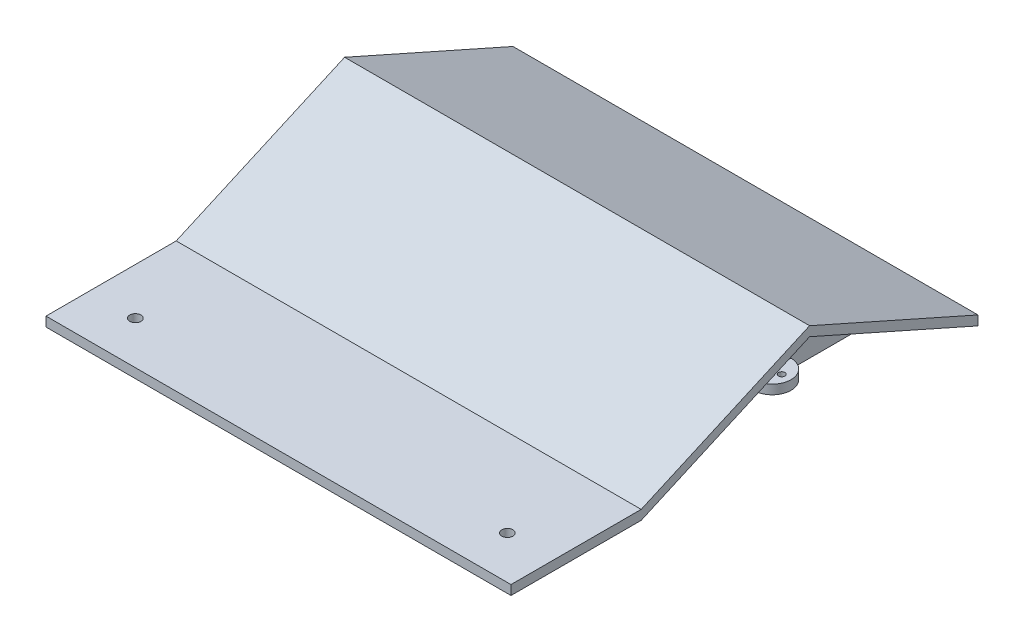
ISO-10303-21;
HEADER;
FILE_DESCRIPTION(('STEP AP214'),'2;1');
FILE_NAME('part.step','',(''),(''),'','','');
FILE_SCHEMA(('AUTOMOTIVE_DESIGN { 1 0 10303 214 1 1 1 1 }'));
ENDSEC;
DATA;
#1=APPLICATION_CONTEXT('core data for automotive mechanical design processes');
#2=APPLICATION_PROTOCOL_DEFINITION('international standard','automotive_design',2000,#1);
#3=PRODUCT_CONTEXT('',#1,'mechanical');
#4=PRODUCT('Part','Part','',(#3));
#5=PRODUCT_RELATED_PRODUCT_CATEGORY('part','',(#4));
#6=PRODUCT_DEFINITION_FORMATION('','',#4);
#7=PRODUCT_DEFINITION_CONTEXT('part definition',#1,'design');
#8=PRODUCT_DEFINITION('design','',#6,#7);
#9=PRODUCT_DEFINITION_SHAPE('','',#8);
#10=(LENGTH_UNIT() NAMED_UNIT(*) SI_UNIT(.MILLI.,.METRE.));
#11=(NAMED_UNIT(*) PLANE_ANGLE_UNIT() SI_UNIT($,.RADIAN.));
#12=(NAMED_UNIT(*) SI_UNIT($,.STERADIAN.) SOLID_ANGLE_UNIT());
#13=UNCERTAINTY_MEASURE_WITH_UNIT(LENGTH_MEASURE(1.E-05),#10,'distance_accuracy_value','');
#14=(GEOMETRIC_REPRESENTATION_CONTEXT(3) GLOBAL_UNCERTAINTY_ASSIGNED_CONTEXT((#13)) GLOBAL_UNIT_ASSIGNED_CONTEXT((#10,
#11,#12)) REPRESENTATION_CONTEXT('',''));
#15=CARTESIAN_POINT('',(0.,0.,0.));
#16=DIRECTION('',(0.,0.,1.));
#17=DIRECTION('',(1.,0.,0.));
#18=AXIS2_PLACEMENT_3D('',#15,#16,#17);
#19=CARTESIAN_POINT('',(-250.,4.27585831422593,1.9003814729893));
#20=DIRECTION('',(0.,-0.913811548620257,-0.406138466053448));
#21=DIRECTION('',(0.,0.406138466053448,-0.913811548620257));
#22=AXIS2_PLACEMENT_3D('',#19,#20,#21);
#23=PLANE('',#22);
#24=DIRECTION('',(0.,0.406138466053448,-0.913811548620257));
#25=VECTOR('',#24,1.);
#26=CARTESIAN_POINT('',(0.,4.27585831422593,1.9003814729893));
#27=LINE('',#26,#25);
#28=CARTESIAN_POINT('',(0.,-5.12047230222117,23.0421253599953));
#29=VERTEX_POINT('',#28);
#30=CARTESIAN_POINT('',(0.,35.1204723022212,-67.5));
#31=VERTEX_POINT('',#30);
#32=EDGE_CURVE('E210',#29,#31,#27,.T.);
#33=ORIENTED_EDGE('',*,*,#32,.T.);
#34=DIRECTION('',(1.,0.,0.));
#35=VECTOR('',#34,1.);
#36=CARTESIAN_POINT('',(-250.,35.1204723022212,-67.5));
#37=LINE('',#36,#35);
#38=CARTESIAN_POINT('',(-250.,35.1204723022212,-67.5));
#39=VERTEX_POINT('',#38);
#40=EDGE_CURVE('E431',#39,#31,#37,.T.);
#41=ORIENTED_EDGE('',*,*,#40,.F.);
#42=DIRECTION('',(0.,0.406138466053448,-0.913811548620257));
#43=VECTOR('',#42,1.);
#44=CARTESIAN_POINT('',(-250.,4.27585831422593,1.9003814729893));
#45=LINE('',#44,#43);
#46=CARTESIAN_POINT('',(-250.,-5.12047230222117,23.0421253599953));
#47=VERTEX_POINT('',#46);
#48=EDGE_CURVE('E401',#47,#39,#45,.T.);
#49=ORIENTED_EDGE('',*,*,#48,.F.);
#50=DIRECTION('',(1.,0.,0.));
#51=VECTOR('',#50,1.);
#52=CARTESIAN_POINT('',(-250.,-5.12047230222117,23.0421253599953));
#53=LINE('',#52,#51);
#54=EDGE_CURVE('E220',#47,#29,#53,.T.);
#55=ORIENTED_EDGE('',*,*,#54,.T.);
#56=EDGE_LOOP('',(#33,#41,#49,#55));
#57=FACE_BOUND('',#56,.T.);
#58=ADVANCED_FACE('F41',(#57),#23,.F.);
#59=CARTESIAN_POINT('',(-250.,54.3789510977311,-24.1684227101027));
#60=DIRECTION('',(0.,0.913811548620257,-0.406138466053448));
#61=DIRECTION('',(0.,0.406138466053448,0.913811548620257));
#62=AXIS2_PLACEMENT_3D('',#59,#60,#61);
#63=PLANE('',#62);
#64=DIRECTION('',(0.,0.406138466053448,0.913811548620257));
#65=VECTOR('',#64,1.);
#66=CARTESIAN_POINT('',(0.,54.3789510977311,-24.1684227101027));
#67=LINE('',#66,#65);
#68=CARTESIAN_POINT('',(0.,-5.12047230222117,-158.042125359995));
#69=VERTEX_POINT('',#68);
#70=EDGE_CURVE('E405',#69,#31,#67,.T.);
#71=ORIENTED_EDGE('',*,*,#70,.F.);
#72=DIRECTION('',(1.,0.,0.));
#73=VECTOR('',#72,1.);
#74=CARTESIAN_POINT('',(-250.,-5.12047230222117,-158.042125359995));
#75=LINE('',#74,#73);
#76=CARTESIAN_POINT('',(-250.,-5.12047230222117,-158.042125359995));
#77=VERTEX_POINT('',#76);
#78=EDGE_CURVE('E435',#77,#69,#75,.T.);
#79=ORIENTED_EDGE('',*,*,#78,.F.);
#80=DIRECTION('',(0.,0.406138466053448,0.913811548620257));
#81=VECTOR('',#80,1.);
#82=CARTESIAN_POINT('',(-250.,54.3789510977311,-24.1684227101027));
#83=LINE('',#82,#81);
#84=EDGE_CURVE('E415',#77,#39,#83,.T.);
#85=ORIENTED_EDGE('',*,*,#84,.T.);
#86=ORIENTED_EDGE('',*,*,#40,.T.);
#87=EDGE_LOOP('',(#71,#79,#85,#86));
#88=FACE_BOUND('',#87,.T.);
#89=ADVANCED_FACE('F498',(#88),#63,.T.);
#90=CARTESIAN_POINT('',(-250.,0.,-158.042125359995));
#91=DIRECTION('',(0.,0.,-1.));
#92=DIRECTION('',(-1.,0.,0.));
#93=AXIS2_PLACEMENT_3D('',#90,#91,#92);
#94=PLANE('',#93);
#95=DIRECTION('',(0.,1.,0.));
#96=VECTOR('',#95,1.);
#97=CARTESIAN_POINT('',(0.,0.,-158.042125359995));
#98=LINE('',#97,#96);
#99=CARTESIAN_POINT('',(0.,-10.2409446044423,-158.042125359995));
#100=VERTEX_POINT('',#99);
#101=EDGE_CURVE('E424',#100,#69,#98,.T.);
#102=ORIENTED_EDGE('',*,*,#101,.F.);
#103=DIRECTION('',(1.,0.,0.));
#104=VECTOR('',#103,1.);
#105=CARTESIAN_POINT('',(-250.,-10.2409446044423,-158.042125359995));
#106=LINE('',#105,#104);
#107=CARTESIAN_POINT('',(-250.,-10.2409446044423,-158.042125359995));
#108=VERTEX_POINT('',#107);
#109=EDGE_CURVE('E438',#108,#100,#106,.T.);
#110=ORIENTED_EDGE('',*,*,#109,.F.);
#111=DIRECTION('',(0.,1.,0.));
#112=VECTOR('',#111,1.);
#113=CARTESIAN_POINT('',(-250.,0.,-158.042125359995));
#114=LINE('',#113,#112);
#115=EDGE_CURVE('E411',#108,#77,#114,.T.);
#116=ORIENTED_EDGE('',*,*,#115,.T.);
#117=ORIENTED_EDGE('',*,*,#78,.T.);
#118=EDGE_LOOP('',(#102,#110,#116,#117));
#119=FACE_BOUND('',#118,.T.);
#120=ADVANCED_FACE('F504',(#119),#94,.T.);
#121=CARTESIAN_POINT('',(-250.,50.1030927835052,-22.2680412371134));
#122=DIRECTION('',(0.,-0.913811548620257,0.406138466053448));
#123=DIRECTION('',(0.,-0.406138466053448,-0.913811548620257));
#124=AXIS2_PLACEMENT_3D('',#121,#122,#123);
#125=PLANE('',#124);
#126=DIRECTION('',(-1.,0.,0.));
#127=VECTOR('',#126,1.);
#128=CARTESIAN_POINT('',(-225.,0.,-135.));
#129=LINE('',#128,#127);
#130=CARTESIAN_POINT('',(-225.,0.,-135.));
#131=VERTEX_POINT('',#130);
#132=CARTESIAN_POINT('',(-230.,0.,-135.));
#133=VERTEX_POINT('',#132);
#134=EDGE_CURVE('E360',#131,#133,#129,.T.);
#135=ORIENTED_EDGE('',*,*,#134,.T.);
#136=DIRECTION('',(-1.,0.,0.));
#137=VECTOR('',#136,1.);
#138=CARTESIAN_POINT('',(-230.,0.,-135.));
#139=LINE('',#138,#137);
#140=CARTESIAN_POINT('',(-250.,0.,-135.));
#141=VERTEX_POINT('',#140);
#142=EDGE_CURVE('E332',#133,#141,#139,.T.);
#143=ORIENTED_EDGE('',*,*,#142,.T.);
#144=DIRECTION('',(0.,-0.406138466053448,-0.913811548620257));
#145=VECTOR('',#144,1.);
#146=CARTESIAN_POINT('',(-250.,50.1030927835052,-22.2680412371134));
#147=LINE('',#146,#145);
#148=EDGE_CURVE('E408',#141,#108,#147,.T.);
#149=ORIENTED_EDGE('',*,*,#148,.T.);
#150=ORIENTED_EDGE('',*,*,#109,.T.);
#151=DIRECTION('',(0.,-0.406138466053448,-0.913811548620257));
#152=VECTOR('',#151,1.);
#153=CARTESIAN_POINT('',(0.,50.1030927835052,-22.2680412371134));
#154=LINE('',#153,#152);
#155=CARTESIAN_POINT('',(0.,29.9999999999999,-67.5));
#156=VERTEX_POINT('',#155);
#157=EDGE_CURVE('E209',#156,#100,#154,.T.);
#158=ORIENTED_EDGE('',*,*,#157,.F.);
#159=DIRECTION('',(1.,0.,0.));
#160=VECTOR('',#159,1.);
#161=CARTESIAN_POINT('',(-20.,29.9999999999999,-67.5));
#162=LINE('',#161,#160);
#163=CARTESIAN_POINT('',(-20.,29.9999999999999,-67.5));
#164=VERTEX_POINT('',#163);
#165=EDGE_CURVE('E204',#164,#156,#162,.T.);
#166=ORIENTED_EDGE('',*,*,#165,.F.);
#167=DIRECTION('',(0.,0.406138466053447,0.913811548620257));
#168=VECTOR('',#167,1.);
#169=CARTESIAN_POINT('',(-20.,0.,-135.));
#170=LINE('',#169,#168);
#171=CARTESIAN_POINT('',(-20.,0.,-135.));
#172=VERTEX_POINT('',#171);
#173=EDGE_CURVE('E375',#172,#164,#170,.T.);
#174=ORIENTED_EDGE('',*,*,#173,.F.);
#175=DIRECTION('',(1.,0.,0.));
#176=VECTOR('',#175,1.);
#177=CARTESIAN_POINT('',(-25.,0.,-135.));
#178=LINE('',#177,#176);
#179=CARTESIAN_POINT('',(-25.,0.,-135.));
#180=VERTEX_POINT('',#179);
#181=EDGE_CURVE('E394',#180,#172,#178,.T.);
#182=ORIENTED_EDGE('',*,*,#181,.F.);
#183=DIRECTION('',(0.,0.406138466053448,0.913811548620257));
#184=VECTOR('',#183,1.);
#185=CARTESIAN_POINT('',(-25.,0.,-135.));
#186=LINE('',#185,#184);
#187=CARTESIAN_POINT('',(-25.,30.,-67.5));
#188=VERTEX_POINT('',#187);
#189=EDGE_CURVE('E389',#180,#188,#186,.T.);
#190=ORIENTED_EDGE('',*,*,#189,.T.);
#191=DIRECTION('',(1.,0.,0.));
#192=VECTOR('',#191,1.);
#193=CARTESIAN_POINT('',(-250.,30.,-67.5));
#194=LINE('',#193,#192);
#195=CARTESIAN_POINT('',(-225.,30.,-67.5));
#196=VERTEX_POINT('',#195);
#197=EDGE_CURVE('E219',#196,#188,#194,.T.);
#198=ORIENTED_EDGE('',*,*,#197,.F.);
#199=DIRECTION('',(0.,-0.406138466053448,-0.913811548620257));
#200=VECTOR('',#199,1.);
#201=CARTESIAN_POINT('',(-225.,30.,-67.5));
#202=LINE('',#201,#200);
#203=EDGE_CURVE('E341',#196,#131,#202,.T.);
#204=ORIENTED_EDGE('',*,*,#203,.T.);
#205=EDGE_LOOP('',(#135,#143,#149,#150,#158,#166,#174,#182,#190,#198,#204));
#206=FACE_BOUND('',#205,.T.);
#207=ADVANCED_FACE('F506',(#206),#125,.T.);
#208=CARTESIAN_POINT('',(-250.,0.,0.));
#209=DIRECTION('',(0.,0.913811548620257,0.406138466053448));
#210=DIRECTION('',(0.,-0.406138466053448,0.913811548620257));
#211=AXIS2_PLACEMENT_3D('',#208,#209,#210);
#212=PLANE('',#211);
#213=DIRECTION('',(0.,-0.406138466053448,0.913811548620257));
#214=VECTOR('',#213,1.);
#215=CARTESIAN_POINT('',(-250.,0.,0.));
#216=LINE('',#215,#214);
#217=CARTESIAN_POINT('',(-250.,0.,0.));
#218=VERTEX_POINT('',#217);
#219=CARTESIAN_POINT('',(-250.,-10.2409446044423,23.0421253599953));
#220=VERTEX_POINT('',#219);
#221=EDGE_CURVE('E404',#218,#220,#216,.T.);
#222=ORIENTED_EDGE('',*,*,#221,.F.);
#223=DIRECTION('',(-1.,0.,0.));
#224=VECTOR('',#223,1.);
#225=CARTESIAN_POINT('',(-230.,0.,0.));
#226=LINE('',#225,#224);
#227=CARTESIAN_POINT('',(-230.,0.,0.));
#228=VERTEX_POINT('',#227);
#229=EDGE_CURVE('E342',#228,#218,#226,.T.);
#230=ORIENTED_EDGE('',*,*,#229,.F.);
#231=DIRECTION('',(-1.,0.,0.));
#232=VECTOR('',#231,1.);
#233=CARTESIAN_POINT('',(-225.,0.,0.));
#234=LINE('',#233,#232);
#235=CARTESIAN_POINT('',(-225.,0.,0.));
#236=VERTEX_POINT('',#235);
#237=EDGE_CURVE('E361',#236,#228,#234,.T.);
#238=ORIENTED_EDGE('',*,*,#237,.F.);
#239=DIRECTION('',(0.,0.406138466053448,-0.913811548620257));
#240=VECTOR('',#239,1.);
#241=CARTESIAN_POINT('',(-225.,0.,0.));
#242=LINE('',#241,#240);
#243=EDGE_CURVE('E356',#236,#196,#242,.T.);
#244=ORIENTED_EDGE('',*,*,#243,.T.);
#245=ORIENTED_EDGE('',*,*,#197,.T.);
#246=DIRECTION('',(0.,-0.406138466053448,0.913811548620257));
#247=VECTOR('',#246,1.);
#248=CARTESIAN_POINT('',(-25.,30.,-67.5));
#249=LINE('',#248,#247);
#250=CARTESIAN_POINT('',(-25.,0.,0.));
#251=VERTEX_POINT('',#250);
#252=EDGE_CURVE('E381',#188,#251,#249,.T.);
#253=ORIENTED_EDGE('',*,*,#252,.T.);
#254=DIRECTION('',(1.,0.,0.));
#255=VECTOR('',#254,1.);
#256=CARTESIAN_POINT('',(-25.,0.,0.));
#257=LINE('',#256,#255);
#258=CARTESIAN_POINT('',(-20.,0.,0.));
#259=VERTEX_POINT('',#258);
#260=EDGE_CURVE('E393',#251,#259,#257,.T.);
#261=ORIENTED_EDGE('',*,*,#260,.T.);
#262=DIRECTION('',(0.,-0.406138466053447,0.913811548620257));
#263=VECTOR('',#262,1.);
#264=CARTESIAN_POINT('',(-20.,29.9999999999999,-67.5));
#265=LINE('',#264,#263);
#266=EDGE_CURVE('E365',#164,#259,#265,.T.);
#267=ORIENTED_EDGE('',*,*,#266,.F.);
#268=ORIENTED_EDGE('',*,*,#165,.T.);
#269=DIRECTION('',(0.,-0.406138466053448,0.913811548620257));
#270=VECTOR('',#269,1.);
#271=CARTESIAN_POINT('',(0.,0.,0.));
#272=LINE('',#271,#270);
#273=CARTESIAN_POINT('',(0.,-10.2409446044423,23.0421253599953));
#274=VERTEX_POINT('',#273);
#275=EDGE_CURVE('E197',#156,#274,#272,.T.);
#276=ORIENTED_EDGE('',*,*,#275,.T.);
#277=DIRECTION('',(1.,0.,0.));
#278=VECTOR('',#277,1.);
#279=CARTESIAN_POINT('',(-250.,-10.2409446044423,23.0421253599953));
#280=LINE('',#279,#278);
#281=EDGE_CURVE('E201',#220,#274,#280,.T.);
#282=ORIENTED_EDGE('',*,*,#281,.F.);
#283=EDGE_LOOP('',(#222,#230,#238,#244,#245,#253,#261,#267,#268,#276,#282));
#284=FACE_BOUND('',#283,.T.);
#285=ADVANCED_FACE('F200',(#284),#212,.F.);
#286=CARTESIAN_POINT('',(-250.,0.,0.));
#287=DIRECTION('',(1.,0.,0.));
#288=DIRECTION('',(0.,0.,-1.));
#289=AXIS2_PLACEMENT_3D('',#286,#287,#288);
#290=PLANE('',#289);
#291=ORIENTED_EDGE('',*,*,#148,.F.);
#292=DIRECTION('',(0.,-0.401404468732289,-0.915900896648622));
#293=VECTOR('',#292,1.);
#294=CARTESIAN_POINT('',(-250.,29.5826783646268,-67.5));
#295=LINE('',#294,#293);
#296=CARTESIAN_POINT('',(-250.,29.5826783646268,-67.5));
#297=VERTEX_POINT('',#296);
#298=EDGE_CURVE('E319',#297,#141,#295,.T.);
#299=ORIENTED_EDGE('',*,*,#298,.F.);
#300=DIRECTION('',(0.,0.401404468732289,-0.915900896648622));
#301=VECTOR('',#300,1.);
#302=CARTESIAN_POINT('',(-250.,0.,0.));
#303=LINE('',#302,#301);
#304=EDGE_CURVE('E324',#218,#297,#303,.T.);
#305=ORIENTED_EDGE('',*,*,#304,.F.);
#306=ORIENTED_EDGE('',*,*,#221,.T.);
#307=DIRECTION('',(0.,0.,1.));
#308=VECTOR('',#307,1.);
#309=CARTESIAN_POINT('',(-250.,-10.2409446044423,93.0421253599953));
#310=LINE('',#309,#308);
#311=CARTESIAN_POINT('',(-250.,-10.2409446044423,93.0421253599953));
#312=VERTEX_POINT('',#311);
#313=EDGE_CURVE('E217',#220,#312,#310,.T.);
#314=ORIENTED_EDGE('',*,*,#313,.T.);
#315=DIRECTION('',(0.,1.,0.));
#316=VECTOR('',#315,1.);
#317=CARTESIAN_POINT('',(-250.,-5.12047230222117,93.0421253599953));
#318=LINE('',#317,#316);
#319=CARTESIAN_POINT('',(-250.,-5.12047230222117,93.0421253599953));
#320=VERTEX_POINT('',#319);
#321=EDGE_CURVE('E235',#312,#320,#318,.T.);
#322=ORIENTED_EDGE('',*,*,#321,.T.);
#323=DIRECTION('',(0.,0.,-1.));
#324=VECTOR('',#323,1.);
#325=CARTESIAN_POINT('',(-250.,-5.12047230222117,23.0421253599953));
#326=LINE('',#325,#324);
#327=EDGE_CURVE('E228',#320,#47,#326,.T.);
#328=ORIENTED_EDGE('',*,*,#327,.T.);
#329=ORIENTED_EDGE('',*,*,#48,.T.);
#330=ORIENTED_EDGE('',*,*,#84,.F.);
#331=ORIENTED_EDGE('',*,*,#115,.F.);
#332=EDGE_LOOP('',(#291,#299,#305,#306,#314,#322,#328,#329,#330,#331));
#333=FACE_BOUND('',#332,.T.);
#334=ADVANCED_FACE('F489',(#333),#290,.F.);
#335=CARTESIAN_POINT('',(0.,0.,0.));
#336=DIRECTION('',(1.,0.,0.));
#337=DIRECTION('',(0.,0.,-1.));
#338=AXIS2_PLACEMENT_3D('',#335,#336,#337);
#339=PLANE('',#338);
#340=ORIENTED_EDGE('',*,*,#275,.F.);
#341=ORIENTED_EDGE('',*,*,#157,.T.);
#342=ORIENTED_EDGE('',*,*,#101,.T.);
#343=ORIENTED_EDGE('',*,*,#70,.T.);
#344=ORIENTED_EDGE('',*,*,#32,.F.);
#345=DIRECTION('',(0.,0.,-1.));
#346=VECTOR('',#345,1.);
#347=CARTESIAN_POINT('',(0.,-5.12047230222117,23.0421253599953));
#348=LINE('',#347,#346);
#349=CARTESIAN_POINT('',(0.,-5.12047230222117,93.0421253599953));
#350=VERTEX_POINT('',#349);
#351=EDGE_CURVE('E232',#350,#29,#348,.T.);
#352=ORIENTED_EDGE('',*,*,#351,.F.);
#353=DIRECTION('',(0.,1.,0.));
#354=VECTOR('',#353,1.);
#355=CARTESIAN_POINT('',(0.,-5.12047230222117,93.0421253599953));
#356=LINE('',#355,#354);
#357=CARTESIAN_POINT('',(0.,-10.2409446044423,93.0421253599953));
#358=VERTEX_POINT('',#357);
#359=EDGE_CURVE('E226',#358,#350,#356,.T.);
#360=ORIENTED_EDGE('',*,*,#359,.F.);
#361=DIRECTION('',(0.,0.,1.));
#362=VECTOR('',#361,1.);
#363=CARTESIAN_POINT('',(0.,-10.2409446044423,93.0421253599953));
#364=LINE('',#363,#362);
#365=EDGE_CURVE('E215',#274,#358,#364,.T.);
#366=ORIENTED_EDGE('',*,*,#365,.F.);
#367=EDGE_LOOP('',(#340,#341,#342,#343,#344,#352,#360,#366));
#368=FACE_BOUND('',#367,.T.);
#369=ADVANCED_FACE('F223',(#368),#339,.T.);
#370=CARTESIAN_POINT('',(-25.,0.,0.));
#371=DIRECTION('',(0.,-1.,0.));
#372=DIRECTION('',(0.,0.,-1.));
#373=AXIS2_PLACEMENT_3D('',#370,#371,#372);
#374=PLANE('',#373);
#375=DIRECTION('',(0.,0.,-1.));
#376=VECTOR('',#375,1.);
#377=CARTESIAN_POINT('',(-20.,0.,0.));
#378=LINE('',#377,#376);
#379=CARTESIAN_POINT('',(-20.,0.,-77.5));
#380=VERTEX_POINT('',#379);
#381=EDGE_CURVE('E371',#380,#172,#378,.T.);
#382=ORIENTED_EDGE('',*,*,#381,.F.);
#383=CARTESIAN_POINT('',(-20.,0.,-67.5));
#384=DIRECTION('',(0.,-1.,0.));
#385=DIRECTION('',(0.,0.,-1.));
#386=AXIS2_PLACEMENT_3D('',#383,#384,#385);
#387=CIRCLE('',#386,10.);
#388=CARTESIAN_POINT('',(-20.,0.,-57.5));
#389=VERTEX_POINT('',#388);
#390=EDGE_CURVE('E273',#380,#389,#387,.T.);
#391=ORIENTED_EDGE('',*,*,#390,.T.);
#392=EDGE_CURVE('E372',#259,#389,#378,.T.);
#393=ORIENTED_EDGE('',*,*,#392,.F.);
#394=ORIENTED_EDGE('',*,*,#260,.F.);
#395=DIRECTION('',(0.,0.,-1.));
#396=VECTOR('',#395,1.);
#397=CARTESIAN_POINT('',(-25.,0.,0.));
#398=LINE('',#397,#396);
#399=CARTESIAN_POINT('',(-25.,0.,-58.8397459621556));
#400=VERTEX_POINT('',#399);
#401=EDGE_CURVE('E386',#251,#400,#398,.T.);
#402=ORIENTED_EDGE('',*,*,#401,.T.);
#403=CARTESIAN_POINT('',(-25.,0.,-76.1602540378444));
#404=VERTEX_POINT('',#403);
#405=EDGE_CURVE('E58',#400,#404,#387,.T.);
#406=ORIENTED_EDGE('',*,*,#405,.T.);
#407=EDGE_CURVE('E385',#404,#180,#398,.T.);
#408=ORIENTED_EDGE('',*,*,#407,.T.);
#409=ORIENTED_EDGE('',*,*,#181,.T.);
#410=EDGE_LOOP('',(#382,#391,#393,#394,#402,#406,#408,#409));
#411=FACE_BOUND('',#410,.T.);
#412=CARTESIAN_POINT('',(-15.,0.,-67.5));
#413=DIRECTION('',(0.,-1.,0.));
#414=DIRECTION('',(0.,0.,-1.));
#415=AXIS2_PLACEMENT_3D('',#412,#413,#414);
#416=CIRCLE('',#415,1.7);
#417=CARTESIAN_POINT('',(-15.,0.,-69.2));
#418=VERTEX_POINT('',#417);
#419=EDGE_CURVE('E277',#418,#418,#416,.T.);
#420=ORIENTED_EDGE('',*,*,#419,.F.);
#421=EDGE_LOOP('',(#420));
#422=FACE_BOUND('',#421,.T.);
#423=ADVANCED_FACE('F551',(#411,#422),#374,.T.);
#424=CARTESIAN_POINT('',(-25.,0.,0.));
#425=DIRECTION('',(-1.,0.,0.));
#426=DIRECTION('',(0.,0.,1.));
#427=AXIS2_PLACEMENT_3D('',#424,#425,#426);
#428=PLANE('',#427);
#429=DIRECTION('',(0.,-1.,0.));
#430=VECTOR('',#429,1.);
#431=CARTESIAN_POINT('',(-25.,5.00000000000001,-76.1602540378444));
#432=LINE('',#431,#430);
#433=CARTESIAN_POINT('',(-25.,5.00000000000001,-76.1602540378444));
#434=VERTEX_POINT('',#433);
#435=EDGE_CURVE('E287',#434,#404,#432,.T.);
#436=ORIENTED_EDGE('',*,*,#435,.F.);
#437=DIRECTION('',(0.,0.,1.));
#438=VECTOR('',#437,1.);
#439=CARTESIAN_POINT('',(-25.,5.,0.));
#440=LINE('',#439,#438);
#441=CARTESIAN_POINT('',(-25.,5.,-58.8397459621556));
#442=VERTEX_POINT('',#441);
#443=EDGE_CURVE('E272',#434,#442,#440,.T.);
#444=ORIENTED_EDGE('',*,*,#443,.T.);
#445=DIRECTION('',(0.,-1.,0.));
#446=VECTOR('',#445,1.);
#447=CARTESIAN_POINT('',(-25.,5.,-58.8397459621556));
#448=LINE('',#447,#446);
#449=EDGE_CURVE('E284',#400,#442,#448,.F.);
#450=ORIENTED_EDGE('',*,*,#449,.F.);
#451=ORIENTED_EDGE('',*,*,#401,.F.);
#452=ORIENTED_EDGE('',*,*,#252,.F.);
#453=ORIENTED_EDGE('',*,*,#189,.F.);
#454=ORIENTED_EDGE('',*,*,#407,.F.);
#455=EDGE_LOOP('',(#436,#444,#450,#451,#452,#453,#454));
#456=FACE_BOUND('',#455,.T.);
#457=ADVANCED_FACE('F547',(#456),#428,.T.);
#458=CARTESIAN_POINT('',(-20.,0.,0.));
#459=DIRECTION('',(-1.,0.,0.));
#460=DIRECTION('',(0.,0.,1.));
#461=AXIS2_PLACEMENT_3D('',#458,#459,#460);
#462=PLANE('',#461);
#463=DIRECTION('',(0.,0.,1.));
#464=VECTOR('',#463,1.);
#465=CARTESIAN_POINT('',(-20.,5.,0.));
#466=LINE('',#465,#464);
#467=CARTESIAN_POINT('',(-20.,5.00000000000001,-77.5));
#468=VERTEX_POINT('',#467);
#469=CARTESIAN_POINT('',(-20.,5.,-57.5));
#470=VERTEX_POINT('',#469);
#471=EDGE_CURVE('E456',#468,#470,#466,.T.);
#472=ORIENTED_EDGE('',*,*,#471,.F.);
#473=DIRECTION('',(0.,-1.,0.));
#474=VECTOR('',#473,1.);
#475=CARTESIAN_POINT('',(-20.,5.00000000000001,-77.5));
#476=LINE('',#475,#474);
#477=EDGE_CURVE('E11',#468,#380,#476,.T.);
#478=ORIENTED_EDGE('',*,*,#477,.T.);
#479=ORIENTED_EDGE('',*,*,#381,.T.);
#480=ORIENTED_EDGE('',*,*,#173,.T.);
#481=ORIENTED_EDGE('',*,*,#266,.T.);
#482=ORIENTED_EDGE('',*,*,#392,.T.);
#483=DIRECTION('',(0.,-1.,0.));
#484=VECTOR('',#483,1.);
#485=CARTESIAN_POINT('',(-20.,5.,-57.5));
#486=LINE('',#485,#484);
#487=EDGE_CURVE('E50',#389,#470,#486,.F.);
#488=ORIENTED_EDGE('',*,*,#487,.T.);
#489=EDGE_LOOP('',(#472,#478,#479,#480,#481,#482,#488));
#490=FACE_BOUND('',#489,.T.);
#491=ADVANCED_FACE('F554',(#490),#462,.F.);
#492=CARTESIAN_POINT('',(-225.,0.,-135.));
#493=DIRECTION('',(0.,-1.,0.));
#494=DIRECTION('',(0.,0.,-1.));
#495=AXIS2_PLACEMENT_3D('',#492,#493,#494);
#496=PLANE('',#495);
#497=DIRECTION('',(0.,0.,1.));
#498=VECTOR('',#497,1.);
#499=CARTESIAN_POINT('',(-230.,0.,-135.));
#500=LINE('',#499,#498);
#501=CARTESIAN_POINT('',(-230.,0.,-57.5));
#502=VERTEX_POINT('',#501);
#503=EDGE_CURVE('E323',#502,#228,#500,.T.);
#504=ORIENTED_EDGE('',*,*,#503,.F.);
#505=CARTESIAN_POINT('',(-230.,0.,-67.5));
#506=DIRECTION('',(0.,-1.,0.));
#507=DIRECTION('',(0.,0.,-1.));
#508=AXIS2_PLACEMENT_3D('',#505,#506,#507);
#509=CIRCLE('',#508,10.);
#510=CARTESIAN_POINT('',(-230.,0.,-77.5));
#511=VERTEX_POINT('',#510);
#512=EDGE_CURVE('E290',#502,#511,#509,.T.);
#513=ORIENTED_EDGE('',*,*,#512,.T.);
#514=EDGE_CURVE('E325',#133,#511,#500,.T.);
#515=ORIENTED_EDGE('',*,*,#514,.F.);
#516=ORIENTED_EDGE('',*,*,#134,.F.);
#517=DIRECTION('',(0.,0.,1.));
#518=VECTOR('',#517,1.);
#519=CARTESIAN_POINT('',(-225.,0.,-135.));
#520=LINE('',#519,#518);
#521=CARTESIAN_POINT('',(-225.,0.,-76.1602540378444));
#522=VERTEX_POINT('',#521);
#523=EDGE_CURVE('E352',#131,#522,#520,.T.);
#524=ORIENTED_EDGE('',*,*,#523,.T.);
#525=CARTESIAN_POINT('',(-225.,0.,-58.8397459621556));
#526=VERTEX_POINT('',#525);
#527=EDGE_CURVE('E305',#522,#526,#509,.T.);
#528=ORIENTED_EDGE('',*,*,#527,.T.);
#529=EDGE_CURVE('E351',#526,#236,#520,.T.);
#530=ORIENTED_EDGE('',*,*,#529,.T.);
#531=ORIENTED_EDGE('',*,*,#237,.T.);
#532=EDGE_LOOP('',(#504,#513,#515,#516,#524,#528,#530,#531));
#533=FACE_BOUND('',#532,.T.);
#534=CARTESIAN_POINT('',(-235.,0.,-67.5));
#535=DIRECTION('',(0.,-1.,0.));
#536=DIRECTION('',(0.,0.,-1.));
#537=AXIS2_PLACEMENT_3D('',#534,#535,#536);
#538=CIRCLE('',#537,1.70000000000001);
#539=CARTESIAN_POINT('',(-235.,0.,-69.2));
#540=VERTEX_POINT('',#539);
#541=EDGE_CURVE('E296',#540,#540,#538,.T.);
#542=ORIENTED_EDGE('',*,*,#541,.F.);
#543=EDGE_LOOP('',(#542));
#544=FACE_BOUND('',#543,.T.);
#545=ADVANCED_FACE('F513',(#533,#544),#496,.T.);
#546=CARTESIAN_POINT('',(-225.,0.,0.));
#547=DIRECTION('',(1.,0.,0.));
#548=DIRECTION('',(0.,0.,-1.));
#549=AXIS2_PLACEMENT_3D('',#546,#547,#548);
#550=PLANE('',#549);
#551=CARTESIAN_POINT('',(-225.,25.,-67.5));
#552=DIRECTION('',(1.,0.,0.));
#553=DIRECTION('',(0.,0.,-1.));
#554=AXIS2_PLACEMENT_3D('',#551,#552,#553);
#555=CIRCLE('',#554,1.5);
#556=CARTESIAN_POINT('',(-225.,25.,-69.));
#557=VERTEX_POINT('',#556);
#558=EDGE_CURVE('E259',#557,#557,#555,.T.);
#559=ORIENTED_EDGE('',*,*,#558,.F.);
#560=EDGE_LOOP('',(#559));
#561=FACE_BOUND('',#560,.T.);
#562=DIRECTION('',(0.,-1.,0.));
#563=VECTOR('',#562,1.);
#564=CARTESIAN_POINT('',(-225.,5.,-58.8397459621556));
#565=LINE('',#564,#563);
#566=CARTESIAN_POINT('',(-225.,5.,-58.8397459621556));
#567=VERTEX_POINT('',#566);
#568=EDGE_CURVE('E315',#567,#526,#565,.T.);
#569=ORIENTED_EDGE('',*,*,#568,.F.);
#570=DIRECTION('',(0.,0.,-1.));
#571=VECTOR('',#570,1.);
#572=CARTESIAN_POINT('',(-225.,5.,0.));
#573=LINE('',#572,#571);
#574=CARTESIAN_POINT('',(-225.,5.00000000000001,-76.1602540378444));
#575=VERTEX_POINT('',#574);
#576=EDGE_CURVE('E301',#567,#575,#573,.T.);
#577=ORIENTED_EDGE('',*,*,#576,.T.);
#578=DIRECTION('',(0.,-1.,0.));
#579=VECTOR('',#578,1.);
#580=CARTESIAN_POINT('',(-225.,5.00000000000001,-76.1602540378444));
#581=LINE('',#580,#579);
#582=EDGE_CURVE('E312',#522,#575,#581,.F.);
#583=ORIENTED_EDGE('',*,*,#582,.F.);
#584=ORIENTED_EDGE('',*,*,#523,.F.);
#585=ORIENTED_EDGE('',*,*,#203,.F.);
#586=ORIENTED_EDGE('',*,*,#243,.F.);
#587=ORIENTED_EDGE('',*,*,#529,.F.);
#588=EDGE_LOOP('',(#569,#577,#583,#584,#585,#586,#587));
#589=FACE_BOUND('',#588,.T.);
#590=ADVANCED_FACE('F538',(#561,#589),#550,.T.);
#591=CARTESIAN_POINT('',(-230.,29.5826783646268,-67.5));
#592=DIRECTION('',(0.,0.915900896648622,-0.401404468732289));
#593=DIRECTION('',(0.,0.401404468732289,0.915900896648622));
#594=AXIS2_PLACEMENT_3D('',#591,#592,#593);
#595=PLANE('',#594);
#596=ORIENTED_EDGE('',*,*,#298,.T.);
#597=ORIENTED_EDGE('',*,*,#142,.F.);
#598=DIRECTION('',(0.,-0.401404468732289,-0.915900896648622));
#599=VECTOR('',#598,1.);
#600=CARTESIAN_POINT('',(-230.,29.5826783646268,-67.5));
#601=LINE('',#600,#599);
#602=CARTESIAN_POINT('',(-230.,29.5826783646268,-67.5));
#603=VERTEX_POINT('',#602);
#604=EDGE_CURVE('E320',#603,#133,#601,.T.);
#605=ORIENTED_EDGE('',*,*,#604,.F.);
#606=DIRECTION('',(-1.,0.,0.));
#607=VECTOR('',#606,1.);
#608=CARTESIAN_POINT('',(-230.,29.5826783646268,-67.5));
#609=LINE('',#608,#607);
#610=EDGE_CURVE('E338',#603,#297,#609,.T.);
#611=ORIENTED_EDGE('',*,*,#610,.T.);
#612=EDGE_LOOP('',(#596,#597,#605,#611));
#613=FACE_BOUND('',#612,.T.);
#614=ADVANCED_FACE('F511',(#613),#595,.F.);
#615=CARTESIAN_POINT('',(-230.,0.,0.));
#616=DIRECTION('',(0.,0.915900896648622,0.401404468732289));
#617=DIRECTION('',(0.,-0.401404468732289,0.915900896648622));
#618=AXIS2_PLACEMENT_3D('',#615,#616,#617);
#619=PLANE('',#618);
#620=ORIENTED_EDGE('',*,*,#304,.T.);
#621=ORIENTED_EDGE('',*,*,#610,.F.);
#622=DIRECTION('',(0.,0.401404468732289,-0.915900896648622));
#623=VECTOR('',#622,1.);
#624=CARTESIAN_POINT('',(-230.,0.,0.));
#625=LINE('',#624,#623);
#626=EDGE_CURVE('E328',#228,#603,#625,.T.);
#627=ORIENTED_EDGE('',*,*,#626,.F.);
#628=ORIENTED_EDGE('',*,*,#229,.T.);
#629=EDGE_LOOP('',(#620,#621,#627,#628));
#630=FACE_BOUND('',#629,.T.);
#631=ADVANCED_FACE('F530',(#630),#619,.F.);
#632=CARTESIAN_POINT('',(-230.,0.,0.));
#633=DIRECTION('',(1.,0.,0.));
#634=DIRECTION('',(0.,0.,-1.));
#635=AXIS2_PLACEMENT_3D('',#632,#633,#634);
#636=PLANE('',#635);
#637=CARTESIAN_POINT('',(-230.,25.,-67.5));
#638=DIRECTION('',(-1.,0.,0.));
#639=DIRECTION('',(0.,0.,1.));
#640=AXIS2_PLACEMENT_3D('',#637,#638,#639);
#641=CIRCLE('',#640,1.5);
#642=CARTESIAN_POINT('',(-230.,25.,-66.));
#643=VERTEX_POINT('',#642);
#644=EDGE_CURVE('E253',#643,#643,#641,.T.);
#645=ORIENTED_EDGE('',*,*,#644,.F.);
#646=EDGE_LOOP('',(#645));
#647=FACE_BOUND('',#646,.T.);
#648=DIRECTION('',(0.,0.,-1.));
#649=VECTOR('',#648,1.);
#650=CARTESIAN_POINT('',(-230.,5.,0.));
#651=LINE('',#650,#649);
#652=CARTESIAN_POINT('',(-230.,5.,-57.5));
#653=VERTEX_POINT('',#652);
#654=CARTESIAN_POINT('',(-230.,5.00000000000001,-77.5));
#655=VERTEX_POINT('',#654);
#656=EDGE_CURVE('E434',#653,#655,#651,.T.);
#657=ORIENTED_EDGE('',*,*,#656,.F.);
#658=DIRECTION('',(0.,-1.,0.));
#659=VECTOR('',#658,1.);
#660=CARTESIAN_POINT('',(-230.,5.,-57.5));
#661=LINE('',#660,#659);
#662=EDGE_CURVE('E452',#653,#502,#661,.T.);
#663=ORIENTED_EDGE('',*,*,#662,.T.);
#664=ORIENTED_EDGE('',*,*,#503,.T.);
#665=ORIENTED_EDGE('',*,*,#626,.T.);
#666=ORIENTED_EDGE('',*,*,#604,.T.);
#667=ORIENTED_EDGE('',*,*,#514,.T.);
#668=DIRECTION('',(0.,-1.,0.));
#669=VECTOR('',#668,1.);
#670=CARTESIAN_POINT('',(-230.,5.00000000000001,-77.5));
#671=LINE('',#670,#669);
#672=EDGE_CURVE('E449',#511,#655,#671,.F.);
#673=ORIENTED_EDGE('',*,*,#672,.T.);
#674=EDGE_LOOP('',(#657,#663,#664,#665,#666,#667,#673));
#675=FACE_BOUND('',#674,.T.);
#676=ADVANCED_FACE('F519',(#647,#675),#636,.F.);
#677=CARTESIAN_POINT('',(-235.,5.00000000000001,-67.5));
#678=DIRECTION('',(0.,-1.,0.));
#679=DIRECTION('',(0.,0.,-1.));
#680=AXIS2_PLACEMENT_3D('',#677,#678,#679);
#681=CYLINDRICAL_SURFACE('',#680,1.70000000000001);
#682=CARTESIAN_POINT('',(-235.,5.00000000000001,-67.5));
#683=DIRECTION('',(0.,-1.,0.));
#684=DIRECTION('',(0.,0.,-1.));
#685=AXIS2_PLACEMENT_3D('',#682,#683,#684);
#686=CIRCLE('',#685,1.70000000000001);
#687=CARTESIAN_POINT('',(-235.,5.00000000000001,-69.2));
#688=VERTEX_POINT('',#687);
#689=EDGE_CURVE('E297',#688,#688,#686,.T.);
#690=ORIENTED_EDGE('',*,*,#689,.F.);
#691=EDGE_LOOP('',(#690));
#692=FACE_BOUND('',#691,.T.);
#693=ORIENTED_EDGE('',*,*,#541,.T.);
#694=EDGE_LOOP('',(#693));
#695=FACE_BOUND('',#694,.T.);
#696=ADVANCED_FACE('F626',(#692,#695),#681,.F.);
#697=CARTESIAN_POINT('',(0.,5.,0.));
#698=DIRECTION('',(0.,-1.,0.));
#699=DIRECTION('',(0.,0.,-1.));
#700=AXIS2_PLACEMENT_3D('',#697,#698,#699);
#701=PLANE('',#700);
#702=ORIENTED_EDGE('',*,*,#689,.T.);
#703=EDGE_LOOP('',(#702));
#704=FACE_BOUND('',#703,.T.);
#705=CARTESIAN_POINT('',(-230.,5.00000000000001,-67.5));
#706=DIRECTION('',(0.,-1.,0.));
#707=DIRECTION('',(0.,0.,-1.));
#708=AXIS2_PLACEMENT_3D('',#705,#706,#707);
#709=CIRCLE('',#708,10.);
#710=EDGE_CURVE('E291',#653,#655,#709,.T.);
#711=ORIENTED_EDGE('',*,*,#710,.F.);
#712=ORIENTED_EDGE('',*,*,#656,.T.);
#713=EDGE_LOOP('',(#711,#712));
#714=FACE_BOUND('',#713,.T.);
#715=ADVANCED_FACE('F525',(#704,#714),#701,.F.);
#716=CARTESIAN_POINT('',(-230.,5.00000000000001,-67.5));
#717=DIRECTION('',(0.,-1.,0.));
#718=DIRECTION('',(0.,0.,-1.));
#719=AXIS2_PLACEMENT_3D('',#716,#717,#718);
#720=CYLINDRICAL_SURFACE('',#719,10.);
#721=ORIENTED_EDGE('',*,*,#662,.F.);
#722=ORIENTED_EDGE('',*,*,#710,.T.);
#723=ORIENTED_EDGE('',*,*,#672,.F.);
#724=ORIENTED_EDGE('',*,*,#512,.F.);
#725=EDGE_LOOP('',(#721,#722,#723,#724));
#726=FACE_BOUND('',#725,.T.);
#727=ADVANCED_FACE('F522',(#726),#720,.T.);
#728=EDGE_CURVE('E295',#575,#567,#709,.T.);
#729=ORIENTED_EDGE('',*,*,#728,.T.);
#730=ORIENTED_EDGE('',*,*,#568,.T.);
#731=ORIENTED_EDGE('',*,*,#527,.F.);
#732=ORIENTED_EDGE('',*,*,#582,.T.);
#733=EDGE_LOOP('',(#729,#730,#731,#732));
#734=FACE_BOUND('',#733,.T.);
#735=ADVANCED_FACE('F628',(#734),#720,.T.);
#736=ORIENTED_EDGE('',*,*,#576,.F.);
#737=ORIENTED_EDGE('',*,*,#728,.F.);
#738=EDGE_LOOP('',(#736,#737));
#739=FACE_BOUND('',#738,.T.);
#740=ADVANCED_FACE('F631',(#739),#701,.F.);
#741=CARTESIAN_POINT('',(-15.,5.,-67.5));
#742=DIRECTION('',(0.,-1.,0.));
#743=DIRECTION('',(0.,0.,-1.));
#744=AXIS2_PLACEMENT_3D('',#741,#742,#743);
#745=CYLINDRICAL_SURFACE('',#744,1.7);
#746=CARTESIAN_POINT('',(-15.,5.,-67.5));
#747=DIRECTION('',(0.,-1.,0.));
#748=DIRECTION('',(0.,0.,-1.));
#749=AXIS2_PLACEMENT_3D('',#746,#747,#748);
#750=CIRCLE('',#749,1.7);
#751=CARTESIAN_POINT('',(-15.,5.,-69.2));
#752=VERTEX_POINT('',#751);
#753=EDGE_CURVE('E267',#752,#752,#750,.T.);
#754=ORIENTED_EDGE('',*,*,#753,.F.);
#755=EDGE_LOOP('',(#754));
#756=FACE_BOUND('',#755,.T.);
#757=ORIENTED_EDGE('',*,*,#419,.T.);
#758=EDGE_LOOP('',(#757));
#759=FACE_BOUND('',#758,.T.);
#760=ADVANCED_FACE('F586',(#756,#759),#745,.F.);
#761=CARTESIAN_POINT('',(0.,5.,0.));
#762=DIRECTION('',(0.,-1.,0.));
#763=DIRECTION('',(0.,0.,-1.));
#764=AXIS2_PLACEMENT_3D('',#761,#762,#763);
#765=PLANE('',#764);
#766=ORIENTED_EDGE('',*,*,#753,.T.);
#767=EDGE_LOOP('',(#766));
#768=FACE_BOUND('',#767,.T.);
#769=CARTESIAN_POINT('',(-20.,5.,-67.5));
#770=DIRECTION('',(0.,-1.,0.));
#771=DIRECTION('',(0.,0.,-1.));
#772=AXIS2_PLACEMENT_3D('',#769,#770,#771);
#773=CIRCLE('',#772,10.);
#774=EDGE_CURVE('E263',#468,#470,#773,.T.);
#775=ORIENTED_EDGE('',*,*,#774,.F.);
#776=ORIENTED_EDGE('',*,*,#471,.T.);
#777=EDGE_LOOP('',(#775,#776));
#778=FACE_BOUND('',#777,.T.);
#779=ADVANCED_FACE('F560',(#768,#778),#765,.F.);
#780=CARTESIAN_POINT('',(-20.,5.,-67.5));
#781=DIRECTION('',(0.,-1.,0.));
#782=DIRECTION('',(0.,0.,-1.));
#783=AXIS2_PLACEMENT_3D('',#780,#781,#782);
#784=CYLINDRICAL_SURFACE('',#783,10.);
#785=ORIENTED_EDGE('',*,*,#477,.F.);
#786=ORIENTED_EDGE('',*,*,#774,.T.);
#787=ORIENTED_EDGE('',*,*,#487,.F.);
#788=ORIENTED_EDGE('',*,*,#390,.F.);
#789=EDGE_LOOP('',(#785,#786,#787,#788));
#790=FACE_BOUND('',#789,.T.);
#791=ADVANCED_FACE('F557',(#790),#784,.T.);
#792=EDGE_CURVE('E268',#442,#434,#773,.T.);
#793=ORIENTED_EDGE('',*,*,#792,.T.);
#794=ORIENTED_EDGE('',*,*,#435,.T.);
#795=ORIENTED_EDGE('',*,*,#405,.F.);
#796=ORIENTED_EDGE('',*,*,#449,.T.);
#797=EDGE_LOOP('',(#793,#794,#795,#796));
#798=FACE_BOUND('',#797,.T.);
#799=ADVANCED_FACE('F571',(#798),#784,.T.);
#800=ORIENTED_EDGE('',*,*,#443,.F.);
#801=ORIENTED_EDGE('',*,*,#792,.F.);
#802=EDGE_LOOP('',(#800,#801));
#803=FACE_BOUND('',#802,.T.);
#804=ADVANCED_FACE('F573',(#803),#765,.F.);
#805=CARTESIAN_POINT('',(-220.,25.,-67.5));
#806=DIRECTION('',(-1.,0.,0.));
#807=DIRECTION('',(0.,0.,1.));
#808=AXIS2_PLACEMENT_3D('',#805,#806,#807);
#809=CYLINDRICAL_SURFACE('',#808,1.5);
#810=ORIENTED_EDGE('',*,*,#558,.T.);
#811=EDGE_LOOP('',(#810));
#812=FACE_BOUND('',#811,.T.);
#813=ORIENTED_EDGE('',*,*,#644,.T.);
#814=EDGE_LOOP('',(#813));
#815=FACE_BOUND('',#814,.T.);
#816=ADVANCED_FACE('F482',(#812,#815),#809,.F.);
#817=CARTESIAN_POINT('',(0.,-5.12047230222117,23.0421253599953));
#818=DIRECTION('',(0.,1.,0.));
#819=DIRECTION('',(0.,0.,1.));
#820=AXIS2_PLACEMENT_3D('',#817,#818,#819);
#821=PLANE('',#820);
#822=CARTESIAN_POINT('',(-25.,-5.12047230222117,70.));
#823=DIRECTION('',(0.,1.,0.));
#824=DIRECTION('',(0.,0.,1.));
#825=AXIS2_PLACEMENT_3D('',#822,#823,#824);
#826=CIRCLE('',#825,3.);
#827=CARTESIAN_POINT('',(-25.,-5.12047230222118,73.));
#828=VERTEX_POINT('',#827);
#829=EDGE_CURVE('E463',#828,#828,#826,.T.);
#830=ORIENTED_EDGE('',*,*,#829,.F.);
#831=EDGE_LOOP('',(#830));
#832=FACE_BOUND('',#831,.T.);
#833=CARTESIAN_POINT('',(-225.,-5.12047230222117,70.));
#834=DIRECTION('',(0.,1.,0.));
#835=DIRECTION('',(0.,0.,1.));
#836=AXIS2_PLACEMENT_3D('',#833,#834,#835);
#837=CIRCLE('',#836,2.99999999999999);
#838=CARTESIAN_POINT('',(-225.,-5.12047230222118,73.));
#839=VERTEX_POINT('',#838);
#840=EDGE_CURVE('E238',#839,#839,#837,.T.);
#841=ORIENTED_EDGE('',*,*,#840,.F.);
#842=EDGE_LOOP('',(#841));
#843=FACE_BOUND('',#842,.T.);
#844=ORIENTED_EDGE('',*,*,#327,.F.);
#845=DIRECTION('',(-1.,0.,0.));
#846=VECTOR('',#845,1.);
#847=CARTESIAN_POINT('',(0.,-5.12047230222117,93.0421253599953));
#848=LINE('',#847,#846);
#849=EDGE_CURVE('E250',#350,#320,#848,.T.);
#850=ORIENTED_EDGE('',*,*,#849,.F.);
#851=ORIENTED_EDGE('',*,*,#351,.T.);
#852=ORIENTED_EDGE('',*,*,#54,.F.);
#853=EDGE_LOOP('',(#844,#850,#851,#852));
#854=FACE_BOUND('',#853,.T.);
#855=ADVANCED_FACE('F478',(#832,#843,#854),#821,.T.);
#856=CARTESIAN_POINT('',(0.,-5.12047230222117,93.0421253599953));
#857=DIRECTION('',(0.,0.,1.));
#858=DIRECTION('',(1.,0.,0.));
#859=AXIS2_PLACEMENT_3D('',#856,#857,#858);
#860=PLANE('',#859);
#861=ORIENTED_EDGE('',*,*,#321,.F.);
#862=DIRECTION('',(-1.,0.,0.));
#863=VECTOR('',#862,1.);
#864=CARTESIAN_POINT('',(0.,-10.2409446044423,93.0421253599953));
#865=LINE('',#864,#863);
#866=EDGE_CURVE('E244',#358,#312,#865,.T.);
#867=ORIENTED_EDGE('',*,*,#866,.F.);
#868=ORIENTED_EDGE('',*,*,#359,.T.);
#869=ORIENTED_EDGE('',*,*,#849,.T.);
#870=EDGE_LOOP('',(#861,#867,#868,#869));
#871=FACE_BOUND('',#870,.T.);
#872=ADVANCED_FACE('F481',(#871),#860,.T.);
#873=CARTESIAN_POINT('',(0.,-10.2409446044423,93.0421253599953));
#874=DIRECTION('',(0.,-1.,0.));
#875=DIRECTION('',(0.,0.,-1.));
#876=AXIS2_PLACEMENT_3D('',#873,#874,#875);
#877=PLANE('',#876);
#878=CARTESIAN_POINT('',(-25.,-10.2409446044423,70.));
#879=DIRECTION('',(0.,-1.,0.));
#880=DIRECTION('',(0.,0.,-1.));
#881=AXIS2_PLACEMENT_3D('',#878,#879,#880);
#882=CIRCLE('',#881,3.);
#883=CARTESIAN_POINT('',(-25.,-10.2409446044423,73.));
#884=VERTEX_POINT('',#883);
#885=EDGE_CURVE('E44',#884,#884,#882,.T.);
#886=ORIENTED_EDGE('',*,*,#885,.F.);
#887=EDGE_LOOP('',(#886));
#888=FACE_BOUND('',#887,.T.);
#889=CARTESIAN_POINT('',(-225.,-10.2409446044423,70.));
#890=DIRECTION('',(0.,-1.,0.));
#891=DIRECTION('',(0.,0.,-1.));
#892=AXIS2_PLACEMENT_3D('',#889,#890,#891);
#893=CIRCLE('',#892,2.99999999999999);
#894=CARTESIAN_POINT('',(-225.,-10.2409446044423,73.));
#895=VERTEX_POINT('',#894);
#896=EDGE_CURVE('E460',#895,#895,#893,.T.);
#897=ORIENTED_EDGE('',*,*,#896,.F.);
#898=EDGE_LOOP('',(#897));
#899=FACE_BOUND('',#898,.T.);
#900=ORIENTED_EDGE('',*,*,#313,.F.);
#901=ORIENTED_EDGE('',*,*,#281,.T.);
#902=ORIENTED_EDGE('',*,*,#365,.T.);
#903=ORIENTED_EDGE('',*,*,#866,.T.);
#904=EDGE_LOOP('',(#900,#901,#902,#903));
#905=FACE_BOUND('',#904,.T.);
#906=ADVANCED_FACE('F214',(#888,#899,#905),#877,.T.);
#907=CARTESIAN_POINT('',(-225.,-95.1204723022212,70.));
#908=DIRECTION('',(0.,1.,0.));
#909=DIRECTION('',(0.,0.,1.));
#910=AXIS2_PLACEMENT_3D('',#907,#908,#909);
#911=CYLINDRICAL_SURFACE('',#910,2.99999999999999);
#912=CARTESIAN_POINT('',(-225.,-10.2409446044423,73.));
#913=CARTESIAN_POINT('',(-225.,-10.1876063512942,73.));
#914=CARTESIAN_POINT('',(-225.,-10.1342680981461,73.));
#915=CARTESIAN_POINT('',(-225.,-10.0275915918498,73.));
#916=CARTESIAN_POINT('',(-225.,-9.97425333870165,73.));
#917=CARTESIAN_POINT('',(-225.,-9.86757683240537,73.));
#918=CARTESIAN_POINT('',(-225.,-9.81423857925724,73.));
#919=CARTESIAN_POINT('',(-225.,-9.70756207296096,73.));
#920=CARTESIAN_POINT('',(-225.,-9.65422381981283,73.));
#921=CARTESIAN_POINT('',(-225.,-9.54754731351655,73.));
#922=CARTESIAN_POINT('',(-225.,-9.49420906036842,73.));
#923=CARTESIAN_POINT('',(-225.,-9.38753255407214,73.));
#924=CARTESIAN_POINT('',(-225.,-9.33419430092401,73.));
#925=CARTESIAN_POINT('',(-225.,-9.22751779462773,73.));
#926=CARTESIAN_POINT('',(-225.,-9.1741795414796,73.));
#927=CARTESIAN_POINT('',(-225.,-9.06750303518333,73.));
#928=CARTESIAN_POINT('',(-225.,-9.01416478203519,73.));
#929=CARTESIAN_POINT('',(-225.,-8.90748827573891,73.));
#930=CARTESIAN_POINT('',(-225.,-8.85415002259077,73.));
#931=CARTESIAN_POINT('',(-225.,-8.74747351629449,73.));
#932=CARTESIAN_POINT('',(-225.,-8.69413526314635,73.));
#933=CARTESIAN_POINT('',(-225.,-8.58745875685008,73.));
#934=CARTESIAN_POINT('',(-225.,-8.53412050370194,73.));
#935=CARTESIAN_POINT('',(-225.,-8.42744399740567,73.));
#936=CARTESIAN_POINT('',(-225.,-8.37410574425753,73.));
#937=CARTESIAN_POINT('',(-225.,-8.26742923796126,73.));
#938=CARTESIAN_POINT('',(-225.,-8.21409098481312,73.));
#939=CARTESIAN_POINT('',(-225.,-8.10741447851685,73.));
#940=CARTESIAN_POINT('',(-225.,-8.05407622536871,73.));
#941=CARTESIAN_POINT('',(-225.,-7.94739971907244,73.));
#942=CARTESIAN_POINT('',(-225.,-7.8940614659243,73.));
#943=CARTESIAN_POINT('',(-225.,-7.78738495962803,73.));
#944=CARTESIAN_POINT('',(-225.,-7.73404670647989,73.));
#945=CARTESIAN_POINT('',(-225.,-7.62737020018362,73.));
#946=CARTESIAN_POINT('',(-225.,-7.57403194703548,73.));
#947=CARTESIAN_POINT('',(-225.,-7.46735544073921,73.));
#948=CARTESIAN_POINT('',(-225.,-7.41401718759107,73.));
#949=CARTESIAN_POINT('',(-225.,-7.3073406812948,73.));
#950=CARTESIAN_POINT('',(-225.,-7.25400242814666,73.));
#951=CARTESIAN_POINT('',(-225.,-7.14732592185039,73.));
#952=CARTESIAN_POINT('',(-225.,-7.09398766870225,73.));
#953=CARTESIAN_POINT('',(-225.,-6.98731116240598,73.));
#954=CARTESIAN_POINT('',(-225.,-6.93397290925784,73.));
#955=CARTESIAN_POINT('',(-225.,-6.82729640296157,73.));
#956=CARTESIAN_POINT('',(-225.,-6.77395814981343,73.));
#957=CARTESIAN_POINT('',(-225.,-6.66728164351716,73.));
#958=CARTESIAN_POINT('',(-225.,-6.61394339036902,73.));
#959=CARTESIAN_POINT('',(-225.,-6.50726688407274,73.));
#960=CARTESIAN_POINT('',(-225.,-6.4539286309246,73.));
#961=CARTESIAN_POINT('',(-225.,-6.34725212462832,73.));
#962=CARTESIAN_POINT('',(-225.,-6.29391387148019,73.));
#963=CARTESIAN_POINT('',(-225.,-6.18723736518391,73.));
#964=CARTESIAN_POINT('',(-225.,-6.13389911203578,73.));
#965=CARTESIAN_POINT('',(-225.,-6.0272226057395,73.));
#966=CARTESIAN_POINT('',(-225.,-5.97388435259137,73.));
#967=CARTESIAN_POINT('',(-225.,-5.86720784629509,73.));
#968=CARTESIAN_POINT('',(-225.,-5.81386959314696,73.));
#969=CARTESIAN_POINT('',(-225.,-5.70719308685068,73.));
#970=CARTESIAN_POINT('',(-225.,-5.65385483370255,73.));
#971=CARTESIAN_POINT('',(-225.,-5.54717832740627,73.));
#972=CARTESIAN_POINT('',(-225.,-5.49384007425814,73.));
#973=CARTESIAN_POINT('',(-225.,-5.38716356796186,73.));
#974=CARTESIAN_POINT('',(-225.,-5.33382531481373,73.));
#975=CARTESIAN_POINT('',(-225.,-5.22714880851745,73.));
#976=CARTESIAN_POINT('',(-225.,-5.17381055536932,73.));
#977=CARTESIAN_POINT('',(-225.,-5.12047230222118,73.));
#978=B_SPLINE_CURVE_WITH_KNOTS('',3,(#912,#913,#914,#915,#916,#917,#918,#919,#920,#921,#922,
#923,#924,#925,#926,#927,#928,#929,#930,#931,#932,#933,#934,#935,#936,#937,#938,#939,#940,#941,
#942,#943,#944,#945,#946,#947,#948,#949,#950,#951,#952,#953,#954,#955,#956,#957,#958,#959,#960,
#961,#962,#963,#964,#965,#966,#967,#968,#969,#970,#971,#972,#973,#974,#975,#976,#977),
.UNSPECIFIED.,.F.,.F.,(4,2,2,2,2,2,2,2,2,2,2,2,2,2,2,2,2,2,2,2,2,2,2,2,2,2,2,2,2,2,2,2,4),(0.,
0.16001475944441,0.32002951888882,0.48004427833323,0.640059037777641,0.800073797222051,
0.960088556666461,1.12010331611087,1.28011807555528,1.44013283499971,1.60014759444412,
1.76016235388853,1.92017711333294,2.08019187277735,2.24020663222176,2.40022139166617,
2.56023615111058,2.72025091055499,2.8802656699994,3.04028042944381,3.20029518888822,
3.36030994833263,3.52032470777704,3.68033946722145,3.84035422666587,4.00036898611028,
4.16038374555469,4.3203985049991,4.48041326444351,4.64042802388792,4.80044278333233,
4.96045754277674,5.12047230222115),.UNSPECIFIED.);
#979=EDGE_CURVE('BSEAM476',#895,#839,#978,.T.);
#980=ORIENTED_EDGE('',*,*,#896,.T.);
#981=ORIENTED_EDGE('',*,*,#840,.T.);
#982=ORIENTED_EDGE('',*,*,#979,.T.);
#983=ORIENTED_EDGE('',*,*,#979,.F.);
#984=EDGE_LOOP('',(#980,#982,#981,#983));
#985=FACE_BOUND('',#984,.T.);
#986=ADVANCED_FACE('F476',(#985),#911,.F.);
#987=CARTESIAN_POINT('',(-25.,-95.1204723022212,70.));
#988=DIRECTION('',(0.,1.,0.));
#989=DIRECTION('',(0.,0.,1.));
#990=AXIS2_PLACEMENT_3D('',#987,#988,#989);
#991=CYLINDRICAL_SURFACE('',#990,3.);
#992=CARTESIAN_POINT('',(-25.,-10.2409446044423,73.));
#993=CARTESIAN_POINT('',(-25.,-10.1876063512942,73.));
#994=CARTESIAN_POINT('',(-25.,-10.1342680981461,73.));
#995=CARTESIAN_POINT('',(-25.,-10.0275915918498,73.));
#996=CARTESIAN_POINT('',(-25.,-9.97425333870165,73.));
#997=CARTESIAN_POINT('',(-25.,-9.86757683240537,73.));
#998=CARTESIAN_POINT('',(-25.,-9.81423857925724,73.));
#999=CARTESIAN_POINT('',(-25.,-9.70756207296096,73.));
#1000=CARTESIAN_POINT('',(-25.,-9.65422381981283,73.));
#1001=CARTESIAN_POINT('',(-25.,-9.54754731351655,73.));
#1002=CARTESIAN_POINT('',(-25.,-9.49420906036842,73.));
#1003=CARTESIAN_POINT('',(-25.,-9.38753255407214,73.));
#1004=CARTESIAN_POINT('',(-25.,-9.33419430092401,73.));
#1005=CARTESIAN_POINT('',(-25.,-9.22751779462773,73.));
#1006=CARTESIAN_POINT('',(-25.,-9.1741795414796,73.));
#1007=CARTESIAN_POINT('',(-25.,-9.06750303518333,73.));
#1008=CARTESIAN_POINT('',(-25.,-9.01416478203519,73.));
#1009=CARTESIAN_POINT('',(-25.,-8.90748827573891,73.));
#1010=CARTESIAN_POINT('',(-25.,-8.85415002259077,73.));
#1011=CARTESIAN_POINT('',(-25.,-8.74747351629449,73.));
#1012=CARTESIAN_POINT('',(-25.,-8.69413526314635,73.));
#1013=CARTESIAN_POINT('',(-25.,-8.58745875685008,73.));
#1014=CARTESIAN_POINT('',(-25.,-8.53412050370194,73.));
#1015=CARTESIAN_POINT('',(-25.,-8.42744399740567,73.));
#1016=CARTESIAN_POINT('',(-25.,-8.37410574425753,73.));
#1017=CARTESIAN_POINT('',(-25.,-8.26742923796126,73.));
#1018=CARTESIAN_POINT('',(-25.,-8.21409098481312,73.));
#1019=CARTESIAN_POINT('',(-25.,-8.10741447851685,73.));
#1020=CARTESIAN_POINT('',(-25.,-8.05407622536871,73.));
#1021=CARTESIAN_POINT('',(-25.,-7.94739971907244,73.));
#1022=CARTESIAN_POINT('',(-25.,-7.8940614659243,73.));
#1023=CARTESIAN_POINT('',(-25.,-7.78738495962803,73.));
#1024=CARTESIAN_POINT('',(-25.,-7.73404670647989,73.));
#1025=CARTESIAN_POINT('',(-25.,-7.62737020018362,73.));
#1026=CARTESIAN_POINT('',(-25.,-7.57403194703548,73.));
#1027=CARTESIAN_POINT('',(-25.,-7.46735544073921,73.));
#1028=CARTESIAN_POINT('',(-25.,-7.41401718759107,73.));
#1029=CARTESIAN_POINT('',(-25.,-7.3073406812948,73.));
#1030=CARTESIAN_POINT('',(-25.,-7.25400242814666,73.));
#1031=CARTESIAN_POINT('',(-25.,-7.14732592185039,73.));
#1032=CARTESIAN_POINT('',(-25.,-7.09398766870225,73.));
#1033=CARTESIAN_POINT('',(-25.,-6.98731116240598,73.));
#1034=CARTESIAN_POINT('',(-25.,-6.93397290925784,73.));
#1035=CARTESIAN_POINT('',(-25.,-6.82729640296157,73.));
#1036=CARTESIAN_POINT('',(-25.,-6.77395814981343,73.));
#1037=CARTESIAN_POINT('',(-25.,-6.66728164351716,73.));
#1038=CARTESIAN_POINT('',(-25.,-6.61394339036902,73.));
#1039=CARTESIAN_POINT('',(-25.,-6.50726688407274,73.));
#1040=CARTESIAN_POINT('',(-25.,-6.4539286309246,73.));
#1041=CARTESIAN_POINT('',(-25.,-6.34725212462832,73.));
#1042=CARTESIAN_POINT('',(-25.,-6.29391387148019,73.));
#1043=CARTESIAN_POINT('',(-25.,-6.18723736518391,73.));
#1044=CARTESIAN_POINT('',(-25.,-6.13389911203578,73.));
#1045=CARTESIAN_POINT('',(-25.,-6.0272226057395,73.));
#1046=CARTESIAN_POINT('',(-25.,-5.97388435259137,73.));
#1047=CARTESIAN_POINT('',(-25.,-5.86720784629509,73.));
#1048=CARTESIAN_POINT('',(-25.,-5.81386959314696,73.));
#1049=CARTESIAN_POINT('',(-25.,-5.70719308685068,73.));
#1050=CARTESIAN_POINT('',(-25.,-5.65385483370255,73.));
#1051=CARTESIAN_POINT('',(-25.,-5.54717832740627,73.));
#1052=CARTESIAN_POINT('',(-25.,-5.49384007425814,73.));
#1053=CARTESIAN_POINT('',(-25.,-5.38716356796186,73.));
#1054=CARTESIAN_POINT('',(-25.,-5.33382531481373,73.));
#1055=CARTESIAN_POINT('',(-25.,-5.22714880851745,73.));
#1056=CARTESIAN_POINT('',(-25.,-5.17381055536932,73.));
#1057=CARTESIAN_POINT('',(-25.,-5.12047230222118,73.));
#1058=B_SPLINE_CURVE_WITH_KNOTS('',3,(#992,#993,#994,#995,#996,#997,#998,#999,#1000,#1001,#1002,
#1003,#1004,#1005,#1006,#1007,#1008,#1009,#1010,#1011,#1012,#1013,#1014,#1015,#1016,#1017,#1018,
#1019,#1020,#1021,#1022,#1023,#1024,#1025,#1026,#1027,#1028,#1029,#1030,#1031,#1032,#1033,#1034,
#1035,#1036,#1037,#1038,#1039,#1040,#1041,#1042,#1043,#1044,#1045,#1046,#1047,#1048,#1049,#1050,
#1051,#1052,#1053,#1054,#1055,#1056,#1057),.UNSPECIFIED.,.F.,.F.,(4,2,2,2,2,2,2,2,2,2,2,2,2,2,2,
2,2,2,2,2,2,2,2,2,2,2,2,2,2,2,2,2,4),(0.,0.16001475944441,0.32002951888882,0.48004427833323,
0.640059037777641,0.800073797222051,0.960088556666461,1.12010331611087,1.28011807555528,
1.44013283499971,1.60014759444412,1.76016235388853,1.92017711333294,2.08019187277735,
2.24020663222176,2.40022139166617,2.56023615111058,2.72025091055499,2.8802656699994,
3.04028042944381,3.20029518888822,3.36030994833263,3.52032470777704,3.68033946722145,
3.84035422666587,4.00036898611028,4.16038374555469,4.3203985049991,4.48041326444351,
4.64042802388792,4.80044278333233,4.96045754277674,5.12047230222115),.UNSPECIFIED.);
#1059=EDGE_CURVE('BSEAM708',#884,#828,#1058,.T.);
#1060=ORIENTED_EDGE('',*,*,#885,.T.);
#1061=ORIENTED_EDGE('',*,*,#829,.T.);
#1062=ORIENTED_EDGE('',*,*,#1059,.T.);
#1063=ORIENTED_EDGE('',*,*,#1059,.F.);
#1064=EDGE_LOOP('',(#1060,#1062,#1061,#1063));
#1065=FACE_BOUND('',#1064,.T.);
#1066=ADVANCED_FACE('F708',(#1065),#991,.F.);
#1067=CLOSED_SHELL('',(#58,#89,#120,#207,#285,#334,#369,#423,#457,#491,#545,#590,#614,#631,#676,
#696,#715,#727,#735,#740,#760,#779,#791,#799,#804,#816,#855,#872,#906,#986,#1066));
#1068=MANIFOLD_SOLID_BREP('B2',#1067);
#1069=ADVANCED_BREP_SHAPE_REPRESENTATION('',(#18,#1068),#14);
#1070=SHAPE_DEFINITION_REPRESENTATION(#9,#1069);
ENDSEC;
END-ISO-10303-21;
